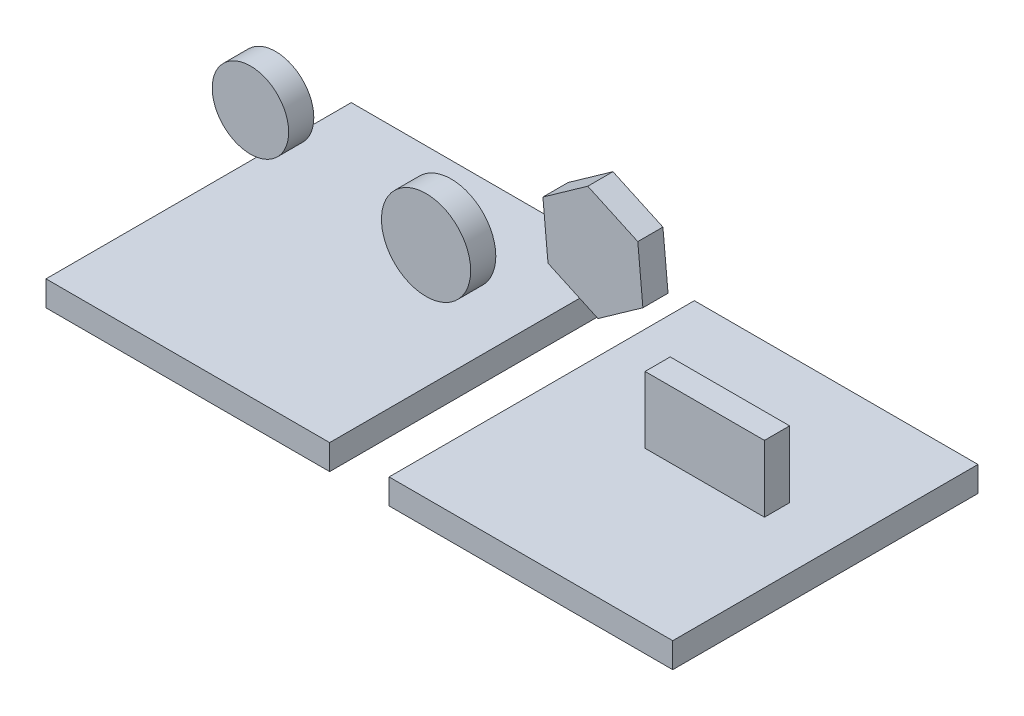
ISO-10303-21;
HEADER;
FILE_DESCRIPTION(('STEP AP214'),'2;1');
FILE_NAME('part.step','',(''),(''),'','','');
FILE_SCHEMA(('AUTOMOTIVE_DESIGN { 1 0 10303 214 1 1 1 1 }'));
ENDSEC;
DATA;
#1=APPLICATION_CONTEXT('core data for automotive mechanical design processes');
#2=APPLICATION_PROTOCOL_DEFINITION('international standard','automotive_design',2000,#1);
#3=PRODUCT_CONTEXT('',#1,'mechanical');
#4=PRODUCT('Part','Part','',(#3));
#5=PRODUCT_RELATED_PRODUCT_CATEGORY('part','',(#4));
#6=PRODUCT_DEFINITION_FORMATION('','',#4);
#7=PRODUCT_DEFINITION_CONTEXT('part definition',#1,'design');
#8=PRODUCT_DEFINITION('design','',#6,#7);
#9=PRODUCT_DEFINITION_SHAPE('','',#8);
#10=(LENGTH_UNIT() NAMED_UNIT(*) SI_UNIT(.MILLI.,.METRE.));
#11=(NAMED_UNIT(*) PLANE_ANGLE_UNIT() SI_UNIT($,.RADIAN.));
#12=(NAMED_UNIT(*) SI_UNIT($,.STERADIAN.) SOLID_ANGLE_UNIT());
#13=UNCERTAINTY_MEASURE_WITH_UNIT(LENGTH_MEASURE(1.E-05),#10,'distance_accuracy_value','');
#14=(GEOMETRIC_REPRESENTATION_CONTEXT(3) GLOBAL_UNCERTAINTY_ASSIGNED_CONTEXT((#13)) GLOBAL_UNIT_ASSIGNED_CONTEXT((#10,
#11,#12)) REPRESENTATION_CONTEXT('',''));
#15=CARTESIAN_POINT('',(0.,0.,0.));
#16=DIRECTION('',(0.,0.,1.));
#17=DIRECTION('',(1.,0.,0.));
#18=AXIS2_PLACEMENT_3D('',#15,#16,#17);
#19=CARTESIAN_POINT('',(110.390174029979,20.0565440245951,10.));
#20=DIRECTION('',(-1.,0.,0.));
#21=DIRECTION('',(0.,0.,1.));
#22=AXIS2_PLACEMENT_3D('',#19,#20,#21);
#23=PLANE('',#22);
#24=DIRECTION('',(0.,1.,0.));
#25=VECTOR('',#24,1.);
#26=CARTESIAN_POINT('',(110.390174029979,20.0565440245951,0.));
#27=LINE('',#26,#25);
#28=CARTESIAN_POINT('',(110.390174029979,20.0565440245951,0.));
#29=VERTEX_POINT('',#28);
#30=CARTESIAN_POINT('',(110.390174029979,46.5264531787898,0.));
#31=VERTEX_POINT('',#30);
#32=EDGE_CURVE('E111',#29,#31,#27,.T.);
#33=ORIENTED_EDGE('',*,*,#32,.T.);
#34=DIRECTION('',(0.,0.,-1.));
#35=VECTOR('',#34,1.);
#36=CARTESIAN_POINT('',(110.390174029979,46.5264531787898,10.));
#37=LINE('',#36,#35);
#38=CARTESIAN_POINT('',(110.390174029979,46.5264531787898,10.));
#39=VERTEX_POINT('',#38);
#40=EDGE_CURVE('E12',#39,#31,#37,.T.);
#41=ORIENTED_EDGE('',*,*,#40,.F.);
#42=DIRECTION('',(0.,1.,0.));
#43=VECTOR('',#42,1.);
#44=CARTESIAN_POINT('',(110.390174029979,20.0565440245951,10.));
#45=LINE('',#44,#43);
#46=CARTESIAN_POINT('',(110.390174029979,20.0565440245951,10.));
#47=VERTEX_POINT('',#46);
#48=EDGE_CURVE('E99',#47,#39,#45,.T.);
#49=ORIENTED_EDGE('',*,*,#48,.F.);
#50=DIRECTION('',(0.,0.,-1.));
#51=VECTOR('',#50,1.);
#52=CARTESIAN_POINT('',(110.390174029979,20.0565440245951,10.));
#53=LINE('',#52,#51);
#54=EDGE_CURVE('E107',#47,#29,#53,.T.);
#55=ORIENTED_EDGE('',*,*,#54,.T.);
#56=EDGE_LOOP('',(#33,#41,#49,#55));
#57=FACE_BOUND('',#56,.T.);
#58=ADVANCED_FACE('F48',(#57),#23,.F.);
#59=CARTESIAN_POINT('',(62.9093881908845,46.5264531787898,10.));
#60=DIRECTION('',(0.,-1.,0.));
#61=DIRECTION('',(0.,0.,-1.));
#62=AXIS2_PLACEMENT_3D('',#59,#60,#61);
#63=PLANE('',#62);
#64=DIRECTION('',(-1.,0.,0.));
#65=VECTOR('',#64,1.);
#66=CARTESIAN_POINT('',(62.9093881908845,46.5264531787898,0.));
#67=LINE('',#66,#65);
#68=CARTESIAN_POINT('',(62.9093881908845,46.5264531787898,0.));
#69=VERTEX_POINT('',#68);
#70=EDGE_CURVE('E103',#31,#69,#67,.T.);
#71=ORIENTED_EDGE('',*,*,#70,.T.);
#72=DIRECTION('',(0.,0.,-1.));
#73=VECTOR('',#72,1.);
#74=CARTESIAN_POINT('',(62.9093881908845,46.5264531787898,10.));
#75=LINE('',#74,#73);
#76=CARTESIAN_POINT('',(62.9093881908845,46.5264531787898,10.));
#77=VERTEX_POINT('',#76);
#78=EDGE_CURVE('E56',#77,#69,#75,.T.);
#79=ORIENTED_EDGE('',*,*,#78,.F.);
#80=DIRECTION('',(-1.,0.,0.));
#81=VECTOR('',#80,1.);
#82=CARTESIAN_POINT('',(62.9093881908845,46.5264531787898,10.));
#83=LINE('',#82,#81);
#84=EDGE_CURVE('E94',#39,#77,#83,.T.);
#85=ORIENTED_EDGE('',*,*,#84,.F.);
#86=ORIENTED_EDGE('',*,*,#40,.T.);
#87=EDGE_LOOP('',(#71,#79,#85,#86));
#88=FACE_BOUND('',#87,.T.);
#89=ADVANCED_FACE('F102',(#88),#63,.F.);
#90=CARTESIAN_POINT('',(62.9093881908845,20.0565440245951,10.));
#91=DIRECTION('',(1.,0.,0.));
#92=DIRECTION('',(0.,0.,-1.));
#93=AXIS2_PLACEMENT_3D('',#90,#91,#92);
#94=PLANE('',#93);
#95=DIRECTION('',(0.,-1.,0.));
#96=VECTOR('',#95,1.);
#97=CARTESIAN_POINT('',(62.9093881908845,20.0565440245951,0.));
#98=LINE('',#97,#96);
#99=CARTESIAN_POINT('',(62.9093881908845,20.0565440245951,0.));
#100=VERTEX_POINT('',#99);
#101=EDGE_CURVE('E81',#69,#100,#98,.T.);
#102=ORIENTED_EDGE('',*,*,#101,.T.);
#103=DIRECTION('',(0.,0.,-1.));
#104=VECTOR('',#103,1.);
#105=CARTESIAN_POINT('',(62.9093881908845,20.0565440245951,10.));
#106=LINE('',#105,#104);
#107=CARTESIAN_POINT('',(62.9093881908845,20.0565440245951,10.));
#108=VERTEX_POINT('',#107);
#109=EDGE_CURVE('E104',#108,#100,#106,.T.);
#110=ORIENTED_EDGE('',*,*,#109,.F.);
#111=DIRECTION('',(0.,-1.,0.));
#112=VECTOR('',#111,1.);
#113=CARTESIAN_POINT('',(62.9093881908845,20.0565440245951,10.));
#114=LINE('',#113,#112);
#115=EDGE_CURVE('E97',#77,#108,#114,.T.);
#116=ORIENTED_EDGE('',*,*,#115,.F.);
#117=ORIENTED_EDGE('',*,*,#78,.T.);
#118=EDGE_LOOP('',(#102,#110,#116,#117));
#119=FACE_BOUND('',#118,.T.);
#120=ADVANCED_FACE('F105',(#119),#94,.F.);
#121=CARTESIAN_POINT('',(62.9093881908845,20.0565440245951,10.));
#122=DIRECTION('',(0.,1.,0.));
#123=DIRECTION('',(0.,0.,1.));
#124=AXIS2_PLACEMENT_3D('',#121,#122,#123);
#125=PLANE('',#124);
#126=DIRECTION('',(1.,0.,0.));
#127=VECTOR('',#126,1.);
#128=CARTESIAN_POINT('',(62.9093881908845,20.0565440245951,0.));
#129=LINE('',#128,#127);
#130=EDGE_CURVE('E87',#100,#29,#129,.T.);
#131=ORIENTED_EDGE('',*,*,#130,.T.);
#132=ORIENTED_EDGE('',*,*,#54,.F.);
#133=DIRECTION('',(1.,0.,0.));
#134=VECTOR('',#133,1.);
#135=CARTESIAN_POINT('',(62.9093881908845,20.0565440245951,10.));
#136=LINE('',#135,#134);
#137=EDGE_CURVE('E64',#108,#47,#136,.T.);
#138=ORIENTED_EDGE('',*,*,#137,.F.);
#139=ORIENTED_EDGE('',*,*,#109,.T.);
#140=EDGE_LOOP('',(#131,#132,#138,#139));
#141=FACE_BOUND('',#140,.T.);
#142=ADVANCED_FACE('F118',(#141),#125,.F.);
#143=CARTESIAN_POINT('',(0.,0.,10.));
#144=DIRECTION('',(0.,0.,-1.));
#145=DIRECTION('',(-1.,0.,0.));
#146=AXIS2_PLACEMENT_3D('',#143,#144,#145);
#147=PLANE('',#146);
#148=ORIENTED_EDGE('',*,*,#48,.T.);
#149=ORIENTED_EDGE('',*,*,#84,.T.);
#150=ORIENTED_EDGE('',*,*,#115,.T.);
#151=ORIENTED_EDGE('',*,*,#137,.T.);
#152=EDGE_LOOP('',(#148,#149,#150,#151));
#153=FACE_BOUND('',#152,.T.);
#154=ADVANCED_FACE('F95',(#153),#147,.F.);
#155=CARTESIAN_POINT('',(0.,0.,0.));
#156=DIRECTION('',(0.,0.,-1.));
#157=DIRECTION('',(-1.,0.,0.));
#158=AXIS2_PLACEMENT_3D('',#155,#156,#157);
#159=PLANE('',#158);
#160=ORIENTED_EDGE('',*,*,#32,.F.);
#161=ORIENTED_EDGE('',*,*,#130,.F.);
#162=ORIENTED_EDGE('',*,*,#101,.F.);
#163=ORIENTED_EDGE('',*,*,#70,.F.);
#164=EDGE_LOOP('',(#160,#161,#162,#163));
#165=FACE_BOUND('',#164,.T.);
#166=ADVANCED_FACE('F121',(#165),#159,.T.);
#167=CLOSED_SHELL('',(#58,#89,#120,#142,#154,#166));
#168=MANIFOLD_SOLID_BREP('B2',#167);
#169=CARTESIAN_POINT('',(44.1977375438419,55.366831397975,10.));
#170=DIRECTION('',(-0.578187144927549,0.815904176628929,0.));
#171=DIRECTION('',(-0.815904176628929,-0.578187144927549,0.));
#172=AXIS2_PLACEMENT_3D('',#169,#170,#171);
#173=PLANE('',#172);
#174=DIRECTION('',(0.815904176628929,0.578187144927549,0.));
#175=VECTOR('',#174,1.);
#176=CARTESIAN_POINT('',(44.1977375438419,55.366831397975,0.));
#177=LINE('',#176,#175);
#178=CARTESIAN_POINT('',(44.1977375438419,55.366831397975,0.));
#179=VERTEX_POINT('',#178);
#180=CARTESIAN_POINT('',(62.0441124110102,68.0135916761095,0.));
#181=VERTEX_POINT('',#180);
#182=EDGE_CURVE('E264',#179,#181,#177,.T.);
#183=ORIENTED_EDGE('',*,*,#182,.T.);
#184=DIRECTION('',(0.,0.,-1.));
#185=VECTOR('',#184,1.);
#186=CARTESIAN_POINT('',(62.0441124110102,68.0135916761095,10.));
#187=LINE('',#186,#185);
#188=CARTESIAN_POINT('',(62.0441124110102,68.0135916761095,10.));
#189=VERTEX_POINT('',#188);
#190=EDGE_CURVE('E46',#189,#181,#187,.T.);
#191=ORIENTED_EDGE('',*,*,#190,.F.);
#192=DIRECTION('',(0.815904176628929,0.578187144927549,0.));
#193=VECTOR('',#192,1.);
#194=CARTESIAN_POINT('',(44.1977375438419,55.366831397975,10.));
#195=LINE('',#194,#193);
#196=CARTESIAN_POINT('',(44.1977375438419,55.366831397975,10.));
#197=VERTEX_POINT('',#196);
#198=EDGE_CURVE('E274',#197,#189,#195,.T.);
#199=ORIENTED_EDGE('',*,*,#198,.F.);
#200=DIRECTION('',(0.,0.,-1.));
#201=VECTOR('',#200,1.);
#202=CARTESIAN_POINT('',(44.1977375438419,55.366831397975,10.));
#203=LINE('',#202,#201);
#204=EDGE_CURVE('E260',#197,#179,#203,.T.);
#205=ORIENTED_EDGE('',*,*,#204,.T.);
#206=EDGE_LOOP('',(#183,#191,#199,#205));
#207=FACE_BOUND('',#206,.T.);
#208=ADVANCED_FACE('F180',(#207),#173,.F.);
#209=CARTESIAN_POINT('',(62.0441124110102,68.0135916761095,10.));
#210=DIRECTION('',(-0.995687316478252,-0.0927726673343892,0.));
#211=DIRECTION('',(0.0927726673343892,-0.995687316478252,0.));
#212=AXIS2_PLACEMENT_3D('',#209,#210,#211);
#213=PLANE('',#212);
#214=DIRECTION('',(-0.0927726673343893,0.995687316478252,0.));
#215=VECTOR('',#214,1.);
#216=CARTESIAN_POINT('',(62.0441124110102,68.0135916761095,0.));
#217=LINE('',#216,#215);
#218=CARTESIAN_POINT('',(60.0148841681578,89.7923858156047,0.));
#219=VERTEX_POINT('',#218);
#220=EDGE_CURVE('E267',#181,#219,#217,.T.);
#221=ORIENTED_EDGE('',*,*,#220,.T.);
#222=DIRECTION('',(0.,0.,-1.));
#223=VECTOR('',#222,1.);
#224=CARTESIAN_POINT('',(60.0148841681578,89.7923858156047,10.));
#225=LINE('',#224,#223);
#226=CARTESIAN_POINT('',(60.0148841681578,89.7923858156047,10.));
#227=VERTEX_POINT('',#226);
#228=EDGE_CURVE('E188',#227,#219,#225,.T.);
#229=ORIENTED_EDGE('',*,*,#228,.F.);
#230=DIRECTION('',(-0.0927726673343893,0.995687316478252,0.));
#231=VECTOR('',#230,1.);
#232=CARTESIAN_POINT('',(62.0441124110102,68.0135916761095,10.));
#233=LINE('',#232,#231);
#234=EDGE_CURVE('E233',#189,#227,#233,.T.);
#235=ORIENTED_EDGE('',*,*,#234,.F.);
#236=ORIENTED_EDGE('',*,*,#190,.T.);
#237=EDGE_LOOP('',(#221,#229,#235,#236));
#238=FACE_BOUND('',#237,.T.);
#239=ADVANCED_FACE('F298',(#238),#213,.F.);
#240=CARTESIAN_POINT('',(60.0148841681578,89.7923858156047,10.));
#241=DIRECTION('',(-0.417500171550703,-0.908676843963316,0.));
#242=DIRECTION('',(0.908676843963316,-0.417500171550703,0.));
#243=AXIS2_PLACEMENT_3D('',#240,#241,#242);
#244=PLANE('',#243);
#245=DIRECTION('',(-0.908676843963316,0.417500171550703,0.));
#246=VECTOR('',#245,1.);
#247=CARTESIAN_POINT('',(60.0148841681578,89.7923858156047,0.));
#248=LINE('',#247,#246);
#249=CARTESIAN_POINT('',(40.1392810581372,98.9244196769653,0.));
#250=VERTEX_POINT('',#249);
#251=EDGE_CURVE('E269',#219,#250,#248,.T.);
#252=ORIENTED_EDGE('',*,*,#251,.T.);
#253=DIRECTION('',(0.,0.,-1.));
#254=VECTOR('',#253,1.);
#255=CARTESIAN_POINT('',(40.1392810581372,98.9244196769653,10.));
#256=LINE('',#255,#254);
#257=CARTESIAN_POINT('',(40.1392810581372,98.9244196769653,10.));
#258=VERTEX_POINT('',#257);
#259=EDGE_CURVE('E255',#258,#250,#256,.T.);
#260=ORIENTED_EDGE('',*,*,#259,.F.);
#261=DIRECTION('',(-0.908676843963316,0.417500171550703,0.));
#262=VECTOR('',#261,1.);
#263=CARTESIAN_POINT('',(60.0148841681578,89.7923858156047,10.));
#264=LINE('',#263,#262);
#265=EDGE_CURVE('E246',#227,#258,#264,.T.);
#266=ORIENTED_EDGE('',*,*,#265,.F.);
#267=ORIENTED_EDGE('',*,*,#228,.T.);
#268=EDGE_LOOP('',(#252,#260,#266,#267));
#269=FACE_BOUND('',#268,.T.);
#270=ADVANCED_FACE('F280',(#269),#244,.F.);
#271=CARTESIAN_POINT('',(40.1392810581372,98.9244196769653,10.));
#272=DIRECTION('',(0.57818714492755,-0.815904176628928,0.));
#273=DIRECTION('',(0.815904176628928,0.57818714492755,0.));
#274=AXIS2_PLACEMENT_3D('',#271,#272,#273);
#275=PLANE('',#274);
#276=DIRECTION('',(-0.815904176628928,-0.57818714492755,0.));
#277=VECTOR('',#276,1.);
#278=CARTESIAN_POINT('',(40.1392810581372,98.9244196769653,0.));
#279=LINE('',#278,#277);
#280=CARTESIAN_POINT('',(22.2929061909689,86.2776593988307,0.));
#281=VERTEX_POINT('',#280);
#282=EDGE_CURVE('E254',#250,#281,#279,.T.);
#283=ORIENTED_EDGE('',*,*,#282,.T.);
#284=DIRECTION('',(0.,0.,-1.));
#285=VECTOR('',#284,1.);
#286=CARTESIAN_POINT('',(22.2929061909689,86.2776593988307,10.));
#287=LINE('',#286,#285);
#288=CARTESIAN_POINT('',(22.2929061909689,86.2776593988307,10.));
#289=VERTEX_POINT('',#288);
#290=EDGE_CURVE('E251',#289,#281,#287,.T.);
#291=ORIENTED_EDGE('',*,*,#290,.F.);
#292=DIRECTION('',(-0.815904176628928,-0.57818714492755,0.));
#293=VECTOR('',#292,1.);
#294=CARTESIAN_POINT('',(40.1392810581372,98.9244196769653,10.));
#295=LINE('',#294,#293);
#296=EDGE_CURVE('E240',#258,#289,#295,.T.);
#297=ORIENTED_EDGE('',*,*,#296,.F.);
#298=ORIENTED_EDGE('',*,*,#259,.T.);
#299=EDGE_LOOP('',(#283,#291,#297,#298));
#300=FACE_BOUND('',#299,.T.);
#301=ADVANCED_FACE('F252',(#300),#275,.F.);
#302=CARTESIAN_POINT('',(22.2929061909689,86.2776593988307,10.));
#303=DIRECTION('',(0.995687316478252,0.0927726673343879,0.));
#304=DIRECTION('',(-0.0927726673343879,0.995687316478252,0.));
#305=AXIS2_PLACEMENT_3D('',#302,#303,#304);
#306=PLANE('',#305);
#307=DIRECTION('',(0.0927726673343879,-0.995687316478252,0.));
#308=VECTOR('',#307,1.);
#309=CARTESIAN_POINT('',(22.2929061909689,86.2776593988307,0.));
#310=LINE('',#309,#308);
#311=CARTESIAN_POINT('',(24.3221344338212,64.4988652593356,0.));
#312=VERTEX_POINT('',#311);
#313=EDGE_CURVE('E219',#281,#312,#310,.T.);
#314=ORIENTED_EDGE('',*,*,#313,.T.);
#315=DIRECTION('',(0.,0.,-1.));
#316=VECTOR('',#315,1.);
#317=CARTESIAN_POINT('',(24.3221344338212,64.4988652593356,10.));
#318=LINE('',#317,#316);
#319=CARTESIAN_POINT('',(24.3221344338212,64.4988652593356,10.));
#320=VERTEX_POINT('',#319);
#321=EDGE_CURVE('E256',#320,#312,#318,.T.);
#322=ORIENTED_EDGE('',*,*,#321,.F.);
#323=DIRECTION('',(0.0927726673343879,-0.995687316478252,0.));
#324=VECTOR('',#323,1.);
#325=CARTESIAN_POINT('',(22.2929061909689,86.2776593988307,10.));
#326=LINE('',#325,#324);
#327=EDGE_CURVE('E244',#289,#320,#326,.T.);
#328=ORIENTED_EDGE('',*,*,#327,.F.);
#329=ORIENTED_EDGE('',*,*,#290,.T.);
#330=EDGE_LOOP('',(#314,#322,#328,#329));
#331=FACE_BOUND('',#330,.T.);
#332=ADVANCED_FACE('F258',(#331),#306,.F.);
#333=CARTESIAN_POINT('',(24.3221344338212,64.4988652593356,10.));
#334=DIRECTION('',(0.417500171550703,0.908676843963316,0.));
#335=DIRECTION('',(-0.908676843963316,0.417500171550703,0.));
#336=AXIS2_PLACEMENT_3D('',#333,#334,#335);
#337=PLANE('',#336);
#338=DIRECTION('',(0.908676843963316,-0.417500171550703,0.));
#339=VECTOR('',#338,1.);
#340=CARTESIAN_POINT('',(24.3221344338212,64.4988652593356,0.));
#341=LINE('',#340,#339);
#342=EDGE_CURVE('E225',#312,#179,#341,.T.);
#343=ORIENTED_EDGE('',*,*,#342,.T.);
#344=ORIENTED_EDGE('',*,*,#204,.F.);
#345=DIRECTION('',(0.908676843963316,-0.417500171550703,0.));
#346=VECTOR('',#345,1.);
#347=CARTESIAN_POINT('',(24.3221344338212,64.4988652593356,10.));
#348=LINE('',#347,#346);
#349=EDGE_CURVE('E196',#320,#197,#348,.T.);
#350=ORIENTED_EDGE('',*,*,#349,.F.);
#351=ORIENTED_EDGE('',*,*,#321,.T.);
#352=EDGE_LOOP('',(#343,#344,#350,#351));
#353=FACE_BOUND('',#352,.T.);
#354=ADVANCED_FACE('F287',(#353),#337,.F.);
#355=CARTESIAN_POINT('',(0.,0.,10.));
#356=DIRECTION('',(0.,0.,1.));
#357=DIRECTION('',(1.,0.,0.));
#358=AXIS2_PLACEMENT_3D('',#355,#356,#357);
#359=PLANE('',#358);
#360=ORIENTED_EDGE('',*,*,#198,.T.);
#361=ORIENTED_EDGE('',*,*,#234,.T.);
#362=ORIENTED_EDGE('',*,*,#265,.T.);
#363=ORIENTED_EDGE('',*,*,#296,.T.);
#364=ORIENTED_EDGE('',*,*,#327,.T.);
#365=ORIENTED_EDGE('',*,*,#349,.T.);
#366=EDGE_LOOP('',(#360,#361,#362,#363,#364,#365));
#367=FACE_BOUND('',#366,.T.);
#368=ADVANCED_FACE('F242',(#367),#359,.T.);
#369=CARTESIAN_POINT('',(0.,0.,0.));
#370=DIRECTION('',(0.,0.,1.));
#371=DIRECTION('',(1.,0.,0.));
#372=AXIS2_PLACEMENT_3D('',#369,#370,#371);
#373=PLANE('',#372);
#374=ORIENTED_EDGE('',*,*,#182,.F.);
#375=ORIENTED_EDGE('',*,*,#342,.F.);
#376=ORIENTED_EDGE('',*,*,#313,.F.);
#377=ORIENTED_EDGE('',*,*,#282,.F.);
#378=ORIENTED_EDGE('',*,*,#251,.F.);
#379=ORIENTED_EDGE('',*,*,#220,.F.);
#380=EDGE_LOOP('',(#374,#375,#376,#377,#378,#379));
#381=FACE_BOUND('',#380,.T.);
#382=ADVANCED_FACE('F283',(#381),#373,.F.);
#383=CLOSED_SHELL('',(#208,#239,#270,#301,#332,#354,#368,#382));
#384=MANIFOLD_SOLID_BREP('B6',#383);
#385=CARTESIAN_POINT('',(-24.1730308094845,46.5264531787898,10.));
#386=DIRECTION('',(0.,0.,-1.));
#387=DIRECTION('',(-1.,0.,0.));
#388=AXIS2_PLACEMENT_3D('',#385,#386,#387);
#389=CYLINDRICAL_SURFACE('',#388,17.7350264602858);
#390=CARTESIAN_POINT('',(-24.1730308094845,46.5264531787898,10.));
#391=DIRECTION('',(0.,0.,1.));
#392=DIRECTION('',(1.,0.,0.));
#393=AXIS2_PLACEMENT_3D('',#390,#391,#392);
#394=CIRCLE('',#393,17.7350264602858);
#395=CARTESIAN_POINT('',(-6.43800434919867,46.5264531787898,10.));
#396=VERTEX_POINT('',#395);
#397=EDGE_CURVE('E179',#396,#396,#394,.T.);
#398=ORIENTED_EDGE('',*,*,#397,.F.);
#399=EDGE_LOOP('',(#398));
#400=FACE_BOUND('',#399,.T.);
#401=CARTESIAN_POINT('',(-24.1730308094845,46.5264531787898,0.));
#402=DIRECTION('',(0.,0.,1.));
#403=DIRECTION('',(1.,0.,0.));
#404=AXIS2_PLACEMENT_3D('',#401,#402,#403);
#405=CIRCLE('',#404,17.7350264602858);
#406=CARTESIAN_POINT('',(-6.43800434919867,46.5264531787898,0.));
#407=VERTEX_POINT('',#406);
#408=EDGE_CURVE('E367',#407,#407,#405,.T.);
#409=ORIENTED_EDGE('',*,*,#408,.T.);
#410=EDGE_LOOP('',(#409));
#411=FACE_BOUND('',#410,.T.);
#412=ADVANCED_FACE('F364',(#400,#411),#389,.T.);
#413=CARTESIAN_POINT('',(-24.1730308094845,46.5264531787898,10.));
#414=DIRECTION('',(0.,0.,1.));
#415=DIRECTION('',(1.,0.,0.));
#416=AXIS2_PLACEMENT_3D('',#413,#414,#415);
#417=PLANE('',#416);
#418=ORIENTED_EDGE('',*,*,#397,.T.);
#419=EDGE_LOOP('',(#418));
#420=FACE_BOUND('',#419,.T.);
#421=ADVANCED_FACE('F379',(#420),#417,.T.);
#422=CARTESIAN_POINT('',(-24.1730308094845,46.5264531787898,0.));
#423=DIRECTION('',(0.,0.,1.));
#424=DIRECTION('',(1.,0.,0.));
#425=AXIS2_PLACEMENT_3D('',#422,#423,#424);
#426=PLANE('',#425);
#427=ORIENTED_EDGE('',*,*,#408,.F.);
#428=EDGE_LOOP('',(#427));
#429=FACE_BOUND('',#428,.T.);
#430=ADVANCED_FACE('F377',(#429),#426,.F.);
#431=CLOSED_SHELL('',(#412,#421,#430));
#432=MANIFOLD_SOLID_BREP('B40',#431);
#433=CARTESIAN_POINT('',(-94.006230925773,58.075790121099,10.));
#434=DIRECTION('',(0.,0.,-1.));
#435=DIRECTION('',(-1.,0.,0.));
#436=AXIS2_PLACEMENT_3D('',#433,#434,#435);
#437=CYLINDRICAL_SURFACE('',#436,15.1984486297696);
#438=CARTESIAN_POINT('',(-94.006230925773,58.075790121099,10.));
#439=DIRECTION('',(0.,0.,1.));
#440=DIRECTION('',(1.,0.,0.));
#441=AXIS2_PLACEMENT_3D('',#438,#439,#440);
#442=CIRCLE('',#441,15.1984486297696);
#443=CARTESIAN_POINT('',(-78.8077822960033,58.075790121099,10.));
#444=VERTEX_POINT('',#443);
#445=EDGE_CURVE('E363',#444,#444,#442,.T.);
#446=ORIENTED_EDGE('',*,*,#445,.F.);
#447=EDGE_LOOP('',(#446));
#448=FACE_BOUND('',#447,.T.);
#449=CARTESIAN_POINT('',(-94.006230925773,58.075790121099,0.));
#450=DIRECTION('',(0.,0.,1.));
#451=DIRECTION('',(1.,0.,0.));
#452=AXIS2_PLACEMENT_3D('',#449,#450,#451);
#453=CIRCLE('',#452,15.1984486297696);
#454=CARTESIAN_POINT('',(-78.8077822960033,58.075790121099,0.));
#455=VERTEX_POINT('',#454);
#456=EDGE_CURVE('E418',#455,#455,#453,.T.);
#457=ORIENTED_EDGE('',*,*,#456,.T.);
#458=EDGE_LOOP('',(#457));
#459=FACE_BOUND('',#458,.T.);
#460=ADVANCED_FACE('F415',(#448,#459),#437,.T.);
#461=CARTESIAN_POINT('',(-94.006230925773,58.075790121099,10.));
#462=DIRECTION('',(0.,0.,1.));
#463=DIRECTION('',(1.,0.,0.));
#464=AXIS2_PLACEMENT_3D('',#461,#462,#463);
#465=PLANE('',#464);
#466=ORIENTED_EDGE('',*,*,#445,.T.);
#467=EDGE_LOOP('',(#466));
#468=FACE_BOUND('',#467,.T.);
#469=ADVANCED_FACE('F430',(#468),#465,.T.);
#470=CARTESIAN_POINT('',(-94.006230925773,58.075790121099,0.));
#471=DIRECTION('',(0.,0.,1.));
#472=DIRECTION('',(1.,0.,0.));
#473=AXIS2_PLACEMENT_3D('',#470,#471,#472);
#474=PLANE('',#473);
#475=ORIENTED_EDGE('',*,*,#456,.F.);
#476=EDGE_LOOP('',(#475));
#477=FACE_BOUND('',#476,.T.);
#478=ADVANCED_FACE('F428',(#477),#474,.F.);
#479=CLOSED_SHELL('',(#460,#469,#478));
#480=MANIFOLD_SOLID_BREP('B174',#479);
#481=CARTESIAN_POINT('',(-124.610213394006,10.,-60.6916278383158));
#482=DIRECTION('',(0.,0.,1.));
#483=DIRECTION('',(1.,0.,0.));
#484=AXIS2_PLACEMENT_3D('',#481,#482,#483);
#485=PLANE('',#484);
#486=DIRECTION('',(-1.,0.,0.));
#487=VECTOR('',#486,1.);
#488=CARTESIAN_POINT('',(-124.610213394006,0.,-60.6916278383158));
#489=LINE('',#488,#487);
#490=CARTESIAN_POINT('',(124.610213394006,0.,-60.6916278383158));
#491=VERTEX_POINT('',#490);
#492=CARTESIAN_POINT('',(11.8179261735257,0.,-60.6916278383158));
#493=VERTEX_POINT('',#492);
#494=EDGE_CURVE('E467',#491,#493,#489,.T.);
#495=ORIENTED_EDGE('',*,*,#494,.T.);
#496=DIRECTION('',(0.,1.,0.));
#497=VECTOR('',#496,1.);
#498=CARTESIAN_POINT('',(11.8179261735257,10.,-60.6916278383158));
#499=LINE('',#498,#497);
#500=CARTESIAN_POINT('',(11.8179261735257,10.,-60.6916278383158));
#501=VERTEX_POINT('',#500);
#502=EDGE_CURVE('E481',#493,#501,#499,.T.);
#503=ORIENTED_EDGE('',*,*,#502,.T.);
#504=DIRECTION('',(-1.,0.,0.));
#505=VECTOR('',#504,1.);
#506=CARTESIAN_POINT('',(-124.610213394006,10.,-60.6916278383158));
#507=LINE('',#506,#505);
#508=CARTESIAN_POINT('',(124.610213394006,10.,-60.6916278383158));
#509=VERTEX_POINT('',#508);
#510=EDGE_CURVE('E514',#509,#501,#507,.T.);
#511=ORIENTED_EDGE('',*,*,#510,.F.);
#512=DIRECTION('',(0.,-1.,0.));
#513=VECTOR('',#512,1.);
#514=CARTESIAN_POINT('',(124.610213394006,10.,-60.6916278383158));
#515=LINE('',#514,#513);
#516=EDGE_CURVE('E506',#509,#491,#515,.T.);
#517=ORIENTED_EDGE('',*,*,#516,.T.);
#518=EDGE_LOOP('',(#495,#503,#511,#517));
#519=FACE_BOUND('',#518,.T.);
#520=ADVANCED_FACE('F464',(#519),#485,.F.);
#521=CARTESIAN_POINT('',(-124.610213394006,10.,60.6916278383158));
#522=DIRECTION('',(0.,0.,-1.));
#523=DIRECTION('',(-1.,0.,0.));
#524=AXIS2_PLACEMENT_3D('',#521,#522,#523);
#525=PLANE('',#524);
#526=DIRECTION('',(1.,0.,0.));
#527=VECTOR('',#526,1.);
#528=CARTESIAN_POINT('',(-124.610213394006,10.,60.6916278383158));
#529=LINE('',#528,#527);
#530=CARTESIAN_POINT('',(11.8179261735257,10.,60.6916278383158));
#531=VERTEX_POINT('',#530);
#532=CARTESIAN_POINT('',(124.610213394006,10.,60.6916278383158));
#533=VERTEX_POINT('',#532);
#534=EDGE_CURVE('E512',#531,#533,#529,.T.);
#535=ORIENTED_EDGE('',*,*,#534,.F.);
#536=DIRECTION('',(0.,-1.,0.));
#537=VECTOR('',#536,1.);
#538=CARTESIAN_POINT('',(11.8179261735257,10.,60.6916278383158));
#539=LINE('',#538,#537);
#540=CARTESIAN_POINT('',(11.8179261735257,0.,60.6916278383158));
#541=VERTEX_POINT('',#540);
#542=EDGE_CURVE('E499',#531,#541,#539,.T.);
#543=ORIENTED_EDGE('',*,*,#542,.T.);
#544=DIRECTION('',(1.,0.,0.));
#545=VECTOR('',#544,1.);
#546=CARTESIAN_POINT('',(-124.610213394006,0.,60.6916278383158));
#547=LINE('',#546,#545);
#548=CARTESIAN_POINT('',(124.610213394006,0.,60.6916278383158));
#549=VERTEX_POINT('',#548);
#550=EDGE_CURVE('E505',#541,#549,#547,.T.);
#551=ORIENTED_EDGE('',*,*,#550,.T.);
#552=DIRECTION('',(0.,-1.,0.));
#553=VECTOR('',#552,1.);
#554=CARTESIAN_POINT('',(124.610213394006,10.,60.6916278383158));
#555=LINE('',#554,#553);
#556=EDGE_CURVE('E517',#533,#549,#555,.T.);
#557=ORIENTED_EDGE('',*,*,#556,.F.);
#558=EDGE_LOOP('',(#535,#543,#551,#557));
#559=FACE_BOUND('',#558,.T.);
#560=ADVANCED_FACE('F515',(#559),#525,.F.);
#561=CARTESIAN_POINT('',(0.,10.,0.));
#562=DIRECTION('',(0.,-1.,0.));
#563=DIRECTION('',(0.,0.,-1.));
#564=AXIS2_PLACEMENT_3D('',#561,#562,#563);
#565=PLANE('',#564);
#566=ORIENTED_EDGE('',*,*,#510,.T.);
#567=DIRECTION('',(0.,0.,-1.));
#568=VECTOR('',#567,1.);
#569=CARTESIAN_POINT('',(11.8179261735257,10.,79.3975347803155));
#570=LINE('',#569,#568);
#571=EDGE_CURVE('E413',#531,#501,#570,.T.);
#572=ORIENTED_EDGE('',*,*,#571,.F.);
#573=ORIENTED_EDGE('',*,*,#534,.T.);
#574=DIRECTION('',(0.,0.,-1.));
#575=VECTOR('',#574,1.);
#576=CARTESIAN_POINT('',(124.610213394006,10.,60.6916278383158));
#577=LINE('',#576,#575);
#578=EDGE_CURVE('E519',#533,#509,#577,.T.);
#579=ORIENTED_EDGE('',*,*,#578,.T.);
#580=EDGE_LOOP('',(#566,#572,#573,#579));
#581=FACE_BOUND('',#580,.T.);
#582=ADVANCED_FACE('F510',(#581),#565,.F.);
#583=CARTESIAN_POINT('',(0.,0.,0.));
#584=DIRECTION('',(0.,-1.,0.));
#585=DIRECTION('',(0.,0.,-1.));
#586=AXIS2_PLACEMENT_3D('',#583,#584,#585);
#587=PLANE('',#586);
#588=DIRECTION('',(0.,0.,1.));
#589=VECTOR('',#588,1.);
#590=CARTESIAN_POINT('',(11.8179261735257,0.,0.));
#591=LINE('',#590,#589);
#592=EDGE_CURVE('E473',#493,#541,#591,.T.);
#593=ORIENTED_EDGE('',*,*,#592,.F.);
#594=ORIENTED_EDGE('',*,*,#494,.F.);
#595=DIRECTION('',(0.,0.,-1.));
#596=VECTOR('',#595,1.);
#597=CARTESIAN_POINT('',(124.610213394006,0.,60.6916278383158));
#598=LINE('',#597,#596);
#599=EDGE_CURVE('E521',#549,#491,#598,.T.);
#600=ORIENTED_EDGE('',*,*,#599,.F.);
#601=ORIENTED_EDGE('',*,*,#550,.F.);
#602=EDGE_LOOP('',(#593,#594,#600,#601));
#603=FACE_BOUND('',#602,.T.);
#604=ADVANCED_FACE('F531',(#603),#587,.T.);
#605=CARTESIAN_POINT('',(124.610213394006,10.,60.6916278383158));
#606=DIRECTION('',(-1.,0.,0.));
#607=DIRECTION('',(0.,0.,1.));
#608=AXIS2_PLACEMENT_3D('',#605,#606,#607);
#609=PLANE('',#608);
#610=ORIENTED_EDGE('',*,*,#599,.T.);
#611=ORIENTED_EDGE('',*,*,#516,.F.);
#612=ORIENTED_EDGE('',*,*,#578,.F.);
#613=ORIENTED_EDGE('',*,*,#556,.T.);
#614=EDGE_LOOP('',(#610,#611,#612,#613));
#615=FACE_BOUND('',#614,.T.);
#616=ADVANCED_FACE('F528',(#615),#609,.F.);
#617=CARTESIAN_POINT('',(11.8179261735257,0.,79.3975347803155));
#618=DIRECTION('',(1.,0.,0.));
#619=DIRECTION('',(0.,0.,-1.));
#620=AXIS2_PLACEMENT_3D('',#617,#618,#619);
#621=PLANE('',#620);
#622=ORIENTED_EDGE('',*,*,#592,.T.);
#623=ORIENTED_EDGE('',*,*,#542,.F.);
#624=ORIENTED_EDGE('',*,*,#571,.T.);
#625=ORIENTED_EDGE('',*,*,#502,.F.);
#626=EDGE_LOOP('',(#622,#623,#624,#625));
#627=FACE_BOUND('',#626,.T.);
#628=ADVANCED_FACE('F501',(#627),#621,.F.);
#629=CLOSED_SHELL('',(#520,#560,#582,#604,#616,#628));
#630=MANIFOLD_SOLID_BREP('B358',#629);
#631=CARTESIAN_POINT('',(-124.610213394006,10.,60.6916278383158));
#632=DIRECTION('',(1.,0.,0.));
#633=DIRECTION('',(0.,0.,-1.));
#634=AXIS2_PLACEMENT_3D('',#631,#632,#633);
#635=PLANE('',#634);
#636=DIRECTION('',(0.,0.,1.));
#637=VECTOR('',#636,1.);
#638=CARTESIAN_POINT('',(-124.610213394006,0.,60.6916278383158));
#639=LINE('',#638,#637);
#640=CARTESIAN_POINT('',(-124.610213394006,0.,-60.6916278383158));
#641=VERTEX_POINT('',#640);
#642=CARTESIAN_POINT('',(-124.610213394006,0.,60.6916278383158));
#643=VERTEX_POINT('',#642);
#644=EDGE_CURVE('E623',#641,#643,#639,.T.);
#645=ORIENTED_EDGE('',*,*,#644,.T.);
#646=DIRECTION('',(0.,-1.,0.));
#647=VECTOR('',#646,1.);
#648=CARTESIAN_POINT('',(-124.610213394006,10.,60.6916278383158));
#649=LINE('',#648,#647);
#650=CARTESIAN_POINT('',(-124.610213394006,10.,60.6916278383158));
#651=VERTEX_POINT('',#650);
#652=EDGE_CURVE('E625',#651,#643,#649,.T.);
#653=ORIENTED_EDGE('',*,*,#652,.F.);
#654=DIRECTION('',(0.,0.,1.));
#655=VECTOR('',#654,1.);
#656=CARTESIAN_POINT('',(-124.610213394006,10.,60.6916278383158));
#657=LINE('',#656,#655);
#658=CARTESIAN_POINT('',(-124.610213394006,10.,-60.6916278383158));
#659=VERTEX_POINT('',#658);
#660=EDGE_CURVE('E610',#659,#651,#657,.T.);
#661=ORIENTED_EDGE('',*,*,#660,.F.);
#662=DIRECTION('',(0.,-1.,0.));
#663=VECTOR('',#662,1.);
#664=CARTESIAN_POINT('',(-124.610213394006,10.,-60.6916278383158));
#665=LINE('',#664,#663);
#666=EDGE_CURVE('E595',#659,#641,#665,.T.);
#667=ORIENTED_EDGE('',*,*,#666,.T.);
#668=EDGE_LOOP('',(#645,#653,#661,#667));
#669=FACE_BOUND('',#668,.T.);
#670=ADVANCED_FACE('F587',(#669),#635,.F.);
#671=CARTESIAN_POINT('',(0.,10.,0.));
#672=DIRECTION('',(0.,-1.,0.));
#673=DIRECTION('',(0.,0.,-1.));
#674=AXIS2_PLACEMENT_3D('',#671,#672,#673);
#675=PLANE('',#674);
#676=DIRECTION('',(1.,0.,0.));
#677=VECTOR('',#676,1.);
#678=CARTESIAN_POINT('',(-124.610213394006,10.,60.6916278383158));
#679=LINE('',#678,#677);
#680=CARTESIAN_POINT('',(-11.8179261735257,10.,60.6916278383158));
#681=VERTEX_POINT('',#680);
#682=EDGE_CURVE('E637',#651,#681,#679,.T.);
#683=ORIENTED_EDGE('',*,*,#682,.T.);
#684=DIRECTION('',(0.,0.,1.));
#685=VECTOR('',#684,1.);
#686=CARTESIAN_POINT('',(-11.8179261735257,10.,79.3975347803155));
#687=LINE('',#686,#685);
#688=CARTESIAN_POINT('',(-11.8179261735257,10.,-60.6916278383158));
#689=VERTEX_POINT('',#688);
#690=EDGE_CURVE('E651',#689,#681,#687,.T.);
#691=ORIENTED_EDGE('',*,*,#690,.F.);
#692=DIRECTION('',(-1.,0.,0.));
#693=VECTOR('',#692,1.);
#694=CARTESIAN_POINT('',(-124.610213394006,10.,-60.6916278383158));
#695=LINE('',#694,#693);
#696=EDGE_CURVE('E640',#689,#659,#695,.T.);
#697=ORIENTED_EDGE('',*,*,#696,.T.);
#698=ORIENTED_EDGE('',*,*,#660,.T.);
#699=EDGE_LOOP('',(#683,#691,#697,#698));
#700=FACE_BOUND('',#699,.T.);
#701=ADVANCED_FACE('F659',(#700),#675,.F.);
#702=CARTESIAN_POINT('',(0.,0.,0.));
#703=DIRECTION('',(0.,-1.,0.));
#704=DIRECTION('',(0.,0.,-1.));
#705=AXIS2_PLACEMENT_3D('',#702,#703,#704);
#706=PLANE('',#705);
#707=DIRECTION('',(0.,0.,-1.));
#708=VECTOR('',#707,1.);
#709=CARTESIAN_POINT('',(-11.8179261735257,0.,0.));
#710=LINE('',#709,#708);
#711=CARTESIAN_POINT('',(-11.8179261735257,0.,60.6916278383158));
#712=VERTEX_POINT('',#711);
#713=CARTESIAN_POINT('',(-11.8179261735257,0.,-60.6916278383158));
#714=VERTEX_POINT('',#713);
#715=EDGE_CURVE('E462',#712,#714,#710,.T.);
#716=ORIENTED_EDGE('',*,*,#715,.F.);
#717=DIRECTION('',(1.,0.,0.));
#718=VECTOR('',#717,1.);
#719=CARTESIAN_POINT('',(-124.610213394006,0.,60.6916278383158));
#720=LINE('',#719,#718);
#721=EDGE_CURVE('E631',#643,#712,#720,.T.);
#722=ORIENTED_EDGE('',*,*,#721,.F.);
#723=ORIENTED_EDGE('',*,*,#644,.F.);
#724=DIRECTION('',(-1.,0.,0.));
#725=VECTOR('',#724,1.);
#726=CARTESIAN_POINT('',(-124.610213394006,0.,-60.6916278383158));
#727=LINE('',#726,#725);
#728=EDGE_CURVE('E632',#714,#641,#727,.T.);
#729=ORIENTED_EDGE('',*,*,#728,.F.);
#730=EDGE_LOOP('',(#716,#722,#723,#729));
#731=FACE_BOUND('',#730,.T.);
#732=ADVANCED_FACE('F639',(#731),#706,.T.);
#733=CARTESIAN_POINT('',(-124.610213394006,10.,60.6916278383158));
#734=DIRECTION('',(0.,0.,-1.));
#735=DIRECTION('',(-1.,0.,0.));
#736=AXIS2_PLACEMENT_3D('',#733,#734,#735);
#737=PLANE('',#736);
#738=ORIENTED_EDGE('',*,*,#721,.T.);
#739=DIRECTION('',(0.,1.,0.));
#740=VECTOR('',#739,1.);
#741=CARTESIAN_POINT('',(-11.8179261735257,10.,60.6916278383158));
#742=LINE('',#741,#740);
#743=EDGE_CURVE('E601',#712,#681,#742,.T.);
#744=ORIENTED_EDGE('',*,*,#743,.T.);
#745=ORIENTED_EDGE('',*,*,#682,.F.);
#746=ORIENTED_EDGE('',*,*,#652,.T.);
#747=EDGE_LOOP('',(#738,#744,#745,#746));
#748=FACE_BOUND('',#747,.T.);
#749=ADVANCED_FACE('F636',(#748),#737,.F.);
#750=CARTESIAN_POINT('',(-124.610213394006,10.,-60.6916278383158));
#751=DIRECTION('',(0.,0.,1.));
#752=DIRECTION('',(1.,0.,0.));
#753=AXIS2_PLACEMENT_3D('',#750,#751,#752);
#754=PLANE('',#753);
#755=ORIENTED_EDGE('',*,*,#696,.F.);
#756=DIRECTION('',(0.,-1.,0.));
#757=VECTOR('',#756,1.);
#758=CARTESIAN_POINT('',(-11.8179261735257,10.,-60.6916278383158));
#759=LINE('',#758,#757);
#760=EDGE_CURVE('E645',#689,#714,#759,.T.);
#761=ORIENTED_EDGE('',*,*,#760,.T.);
#762=ORIENTED_EDGE('',*,*,#728,.T.);
#763=ORIENTED_EDGE('',*,*,#666,.F.);
#764=EDGE_LOOP('',(#755,#761,#762,#763));
#765=FACE_BOUND('',#764,.T.);
#766=ADVANCED_FACE('F589',(#765),#754,.F.);
#767=CARTESIAN_POINT('',(-11.8179261735257,0.,79.3975347803155));
#768=DIRECTION('',(-1.,0.,0.));
#769=DIRECTION('',(0.,0.,1.));
#770=AXIS2_PLACEMENT_3D('',#767,#768,#769);
#771=PLANE('',#770);
#772=ORIENTED_EDGE('',*,*,#690,.T.);
#773=ORIENTED_EDGE('',*,*,#743,.F.);
#774=ORIENTED_EDGE('',*,*,#715,.T.);
#775=ORIENTED_EDGE('',*,*,#760,.F.);
#776=EDGE_LOOP('',(#772,#773,#774,#775));
#777=FACE_BOUND('',#776,.T.);
#778=ADVANCED_FACE('F655',(#777),#771,.F.);
#779=CLOSED_SHELL('',(#670,#701,#732,#749,#766,#778));
#780=MANIFOLD_SOLID_BREP('B407',#779);
#781=ADVANCED_BREP_SHAPE_REPRESENTATION('',(#18,#168,#384,#432,#480,#630,#780),#14);
#782=SHAPE_DEFINITION_REPRESENTATION(#9,#781);
ENDSEC;
END-ISO-10303-21;
